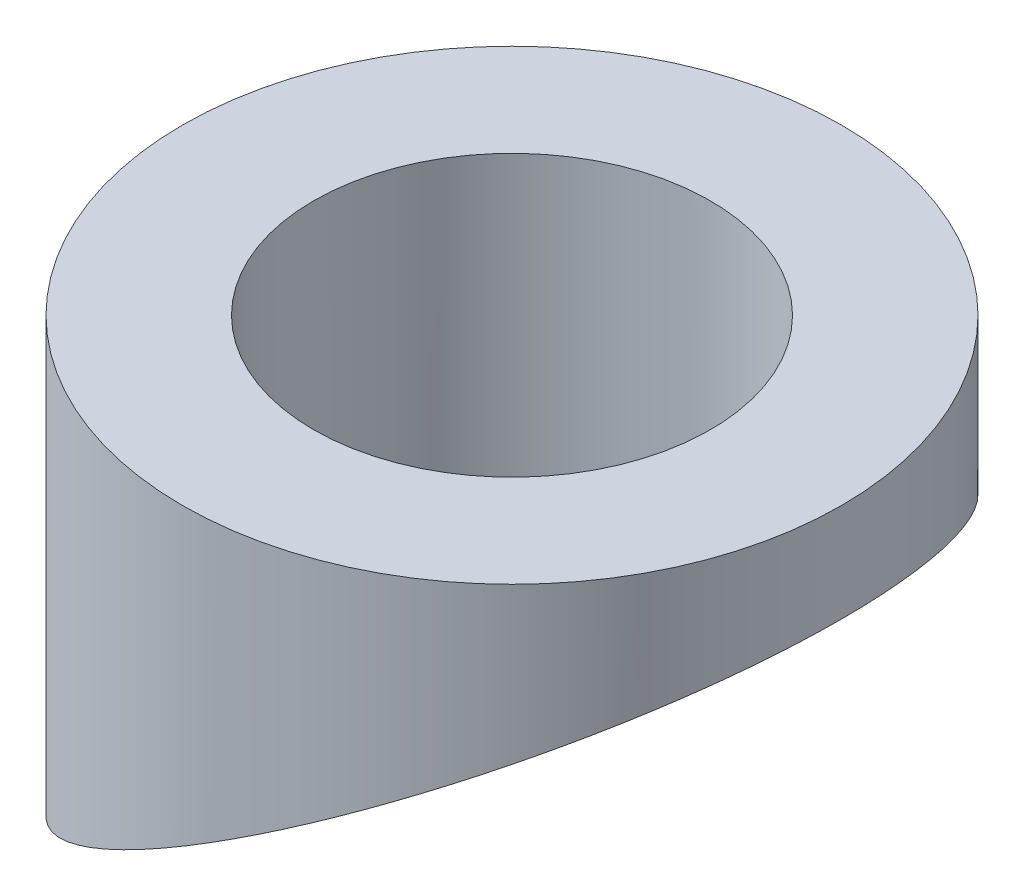
ISO-10303-21;
HEADER;
FILE_DESCRIPTION(('STEP AP214'),'2;1');
FILE_NAME('part.step','',(''),(''),'','','');
FILE_SCHEMA(('AUTOMOTIVE_DESIGN { 1 0 10303 214 1 1 1 1 }'));
ENDSEC;
DATA;
#1=APPLICATION_CONTEXT('core data for automotive mechanical design processes');
#2=APPLICATION_PROTOCOL_DEFINITION('international standard','automotive_design',2000,#1);
#3=PRODUCT_CONTEXT('',#1,'mechanical');
#4=PRODUCT('Part','Part','',(#3));
#5=PRODUCT_RELATED_PRODUCT_CATEGORY('part','',(#4));
#6=PRODUCT_DEFINITION_FORMATION('','',#4);
#7=PRODUCT_DEFINITION_CONTEXT('part definition',#1,'design');
#8=PRODUCT_DEFINITION('design','',#6,#7);
#9=PRODUCT_DEFINITION_SHAPE('','',#8);
#10=(LENGTH_UNIT() NAMED_UNIT(*) SI_UNIT(.MILLI.,.METRE.));
#11=(NAMED_UNIT(*) PLANE_ANGLE_UNIT() SI_UNIT($,.RADIAN.));
#12=(NAMED_UNIT(*) SI_UNIT($,.STERADIAN.) SOLID_ANGLE_UNIT());
#13=UNCERTAINTY_MEASURE_WITH_UNIT(LENGTH_MEASURE(1.E-05),#10,'distance_accuracy_value','');
#14=(GEOMETRIC_REPRESENTATION_CONTEXT(3) GLOBAL_UNCERTAINTY_ASSIGNED_CONTEXT((#13)) GLOBAL_UNIT_ASSIGNED_CONTEXT((#10,
#11,#12)) REPRESENTATION_CONTEXT('',''));
#15=CARTESIAN_POINT('',(0.,0.,0.));
#16=DIRECTION('',(0.,0.,1.));
#17=DIRECTION('',(1.,0.,0.));
#18=AXIS2_PLACEMENT_3D('',#15,#16,#17);
#19=CARTESIAN_POINT('',(0.,15.,0.));
#20=DIRECTION('',(0.,1.,0.));
#21=DIRECTION('',(0.,0.,1.));
#22=AXIS2_PLACEMENT_3D('',#19,#20,#21);
#23=PLANE('',#22);
#24=CARTESIAN_POINT('',(0.,15.,0.));
#25=DIRECTION('',(0.,1.,0.));
#26=DIRECTION('',(0.,0.,1.));
#27=AXIS2_PLACEMENT_3D('',#24,#25,#26);
#28=CIRCLE('',#27,10.05);
#29=CARTESIAN_POINT('',(0.,15.,10.05));
#30=VERTEX_POINT('',#29);
#31=EDGE_CURVE('E10',#30,#30,#28,.T.);
#32=ORIENTED_EDGE('',*,*,#31,.T.);
#33=EDGE_LOOP('',(#32));
#34=FACE_BOUND('',#33,.T.);
#35=CARTESIAN_POINT('',(0.,15.,0.));
#36=DIRECTION('',(0.,1.,0.));
#37=DIRECTION('',(0.,0.,1.));
#38=AXIS2_PLACEMENT_3D('',#35,#36,#37);
#39=CIRCLE('',#38,6.05);
#40=CARTESIAN_POINT('',(0.,15.,6.05));
#41=VERTEX_POINT('',#40);
#42=EDGE_CURVE('E46',#41,#41,#39,.T.);
#43=ORIENTED_EDGE('',*,*,#42,.F.);
#44=EDGE_LOOP('',(#43));
#45=FACE_BOUND('',#44,.T.);
#46=ADVANCED_FACE('F37',(#34,#45),#23,.T.);
#47=CARTESIAN_POINT('',(0.,15.,0.));
#48=DIRECTION('',(0.,-1.,0.));
#49=DIRECTION('',(0.,0.,-1.));
#50=AXIS2_PLACEMENT_3D('',#47,#48,#49);
#51=CYLINDRICAL_SURFACE('',#50,10.05);
#52=ORIENTED_EDGE('',*,*,#31,.F.);
#53=EDGE_LOOP('',(#52));
#54=FACE_BOUND('',#53,.T.);
#55=CARTESIAN_POINT('',(0.,6.,0.));
#56=DIRECTION('',(-0.512609917553606,0.858621611902289,0.));
#57=DIRECTION('',(-0.858621611902289,-0.512609917553606,0.));
#58=AXIS2_PLACEMENT_3D('',#55,#56,#57);
#59=ELLIPSE('',#58,11.7048067049396,10.05);
#60=CARTESIAN_POINT('',(-10.05,0.,0.));
#61=VERTEX_POINT('',#60);
#62=EDGE_CURVE('E51',#61,#61,#59,.T.);
#63=ORIENTED_EDGE('',*,*,#62,.T.);
#64=EDGE_LOOP('',(#63));
#65=FACE_BOUND('',#64,.T.);
#66=ADVANCED_FACE('F39',(#54,#65),#51,.T.);
#67=CARTESIAN_POINT('',(0.,15.,0.));
#68=DIRECTION('',(0.,-1.,0.));
#69=DIRECTION('',(0.,0.,-1.));
#70=AXIS2_PLACEMENT_3D('',#67,#68,#69);
#71=CYLINDRICAL_SURFACE('',#70,6.05);
#72=CARTESIAN_POINT('',(0.,6.,0.));
#73=DIRECTION('',(-0.512609917553606,0.858621611902289,0.));
#74=DIRECTION('',(-0.858621611902289,-0.512609917553606,0.));
#75=AXIS2_PLACEMENT_3D('',#72,#73,#74);
#76=ELLIPSE('',#75,7.04617717063531,6.05);
#77=CARTESIAN_POINT('',(-6.05,2.38805970149254,0.));
#78=VERTEX_POINT('',#77);
#79=EDGE_CURVE('E41',#78,#78,#76,.T.);
#80=ORIENTED_EDGE('',*,*,#79,.F.);
#81=EDGE_LOOP('',(#80));
#82=FACE_BOUND('',#81,.T.);
#83=ORIENTED_EDGE('',*,*,#42,.T.);
#84=EDGE_LOOP('',(#83));
#85=FACE_BOUND('',#84,.T.);
#86=ADVANCED_FACE('F65',(#82,#85),#71,.F.);
#87=CARTESIAN_POINT('',(-10.05,0.,-15.));
#88=DIRECTION('',(-0.512609917553606,0.858621611902289,0.));
#89=DIRECTION('',(-0.858621611902289,-0.512609917553606,0.));
#90=AXIS2_PLACEMENT_3D('',#87,#88,#89);
#91=PLANE('',#90);
#92=ORIENTED_EDGE('',*,*,#79,.T.);
#93=EDGE_LOOP('',(#92));
#94=FACE_BOUND('',#93,.T.);
#95=ORIENTED_EDGE('',*,*,#62,.F.);
#96=EDGE_LOOP('',(#95));
#97=FACE_BOUND('',#96,.T.);
#98=ADVANCED_FACE('F62',(#94,#97),#91,.F.);
#99=CLOSED_SHELL('',(#46,#66,#86,#98));
#100=MANIFOLD_SOLID_BREP('B2',#99);
#101=ADVANCED_BREP_SHAPE_REPRESENTATION('',(#18,#100),#14);
#102=SHAPE_DEFINITION_REPRESENTATION(#9,#101);
ENDSEC;
END-ISO-10303-21;
